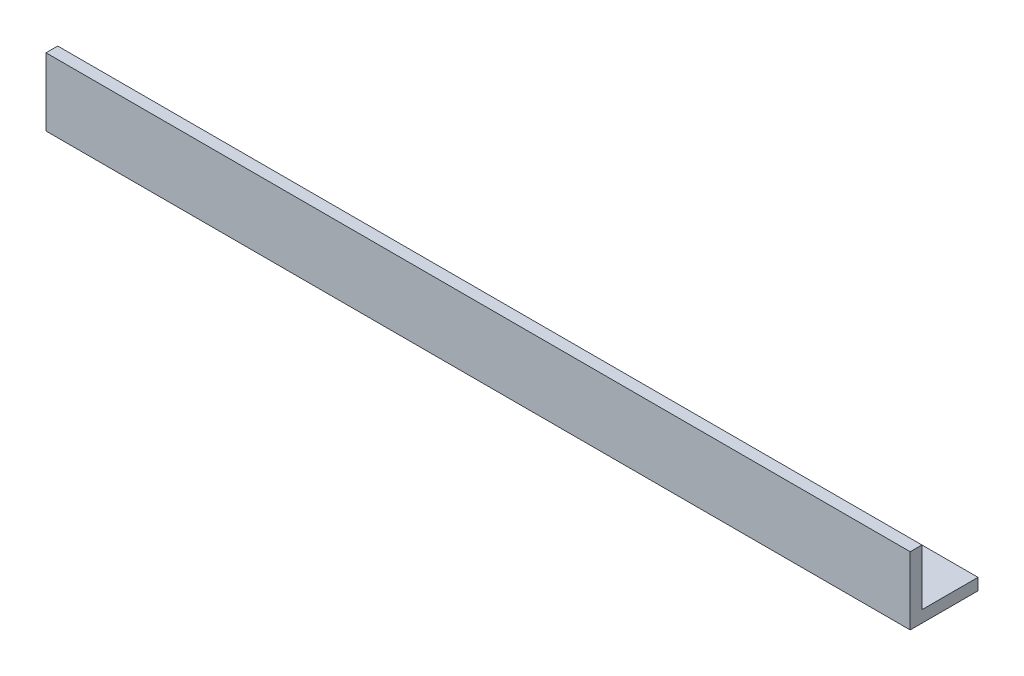
ISO-10303-21;
HEADER;
FILE_DESCRIPTION(('STEP AP214'),'2;1');
FILE_NAME('part.step','',(''),(''),'','','');
FILE_SCHEMA(('AUTOMOTIVE_DESIGN { 1 0 10303 214 1 1 1 1 }'));
ENDSEC;
DATA;
#1=APPLICATION_CONTEXT('core data for automotive mechanical design processes');
#2=APPLICATION_PROTOCOL_DEFINITION('international standard','automotive_design',2000,#1);
#3=PRODUCT_CONTEXT('',#1,'mechanical');
#4=PRODUCT('Part','Part','',(#3));
#5=PRODUCT_RELATED_PRODUCT_CATEGORY('part','',(#4));
#6=PRODUCT_DEFINITION_FORMATION('','',#4);
#7=PRODUCT_DEFINITION_CONTEXT('part definition',#1,'design');
#8=PRODUCT_DEFINITION('design','',#6,#7);
#9=PRODUCT_DEFINITION_SHAPE('','',#8);
#10=(LENGTH_UNIT() NAMED_UNIT(*) SI_UNIT(.MILLI.,.METRE.));
#11=(NAMED_UNIT(*) PLANE_ANGLE_UNIT() SI_UNIT($,.RADIAN.));
#12=(NAMED_UNIT(*) SI_UNIT($,.STERADIAN.) SOLID_ANGLE_UNIT());
#13=UNCERTAINTY_MEASURE_WITH_UNIT(LENGTH_MEASURE(1.E-05),#10,'distance_accuracy_value','');
#14=(GEOMETRIC_REPRESENTATION_CONTEXT(3) GLOBAL_UNCERTAINTY_ASSIGNED_CONTEXT((#13)) GLOBAL_UNIT_ASSIGNED_CONTEXT((#10,
#11,#12)) REPRESENTATION_CONTEXT('',''));
#15=CARTESIAN_POINT('',(0.,0.,0.));
#16=DIRECTION('',(0.,0.,1.));
#17=DIRECTION('',(1.,0.,0.));
#18=AXIS2_PLACEMENT_3D('',#15,#16,#17);
#19=CARTESIAN_POINT('',(255.,20.,0.));
#20=DIRECTION('',(0.,0.,-1.));
#21=DIRECTION('',(0.,1.,0.));
#22=AXIS2_PLACEMENT_3D('',#19,#20,#21);
#23=PLANE('',#22);
#24=DIRECTION('',(0.,-1.,0.));
#25=VECTOR('',#24,1.);
#26=CARTESIAN_POINT('',(0.,20.,0.));
#27=LINE('',#26,#25);
#28=CARTESIAN_POINT('',(0.,20.,0.));
#29=VERTEX_POINT('',#28);
#30=CARTESIAN_POINT('',(0.,0.,0.));
#31=VERTEX_POINT('',#30);
#32=EDGE_CURVE('E121',#29,#31,#27,.T.);
#33=ORIENTED_EDGE('',*,*,#32,.T.);
#34=DIRECTION('',(-1.,0.,0.));
#35=VECTOR('',#34,1.);
#36=CARTESIAN_POINT('',(255.,0.,0.));
#37=LINE('',#36,#35);
#38=CARTESIAN_POINT('',(255.,0.,0.));
#39=VERTEX_POINT('',#38);
#40=EDGE_CURVE('E11',#39,#31,#37,.T.);
#41=ORIENTED_EDGE('',*,*,#40,.F.);
#42=DIRECTION('',(0.,-1.,0.));
#43=VECTOR('',#42,1.);
#44=CARTESIAN_POINT('',(255.,20.,0.));
#45=LINE('',#44,#43);
#46=CARTESIAN_POINT('',(255.,20.,0.));
#47=VERTEX_POINT('',#46);
#48=EDGE_CURVE('E131',#47,#39,#45,.T.);
#49=ORIENTED_EDGE('',*,*,#48,.F.);
#50=DIRECTION('',(-1.,0.,0.));
#51=VECTOR('',#50,1.);
#52=CARTESIAN_POINT('',(255.,20.,0.));
#53=LINE('',#52,#51);
#54=EDGE_CURVE('E117',#47,#29,#53,.T.);
#55=ORIENTED_EDGE('',*,*,#54,.T.);
#56=EDGE_LOOP('',(#33,#41,#49,#55));
#57=FACE_BOUND('',#56,.T.);
#58=ADVANCED_FACE('F37',(#57),#23,.F.);
#59=CARTESIAN_POINT('',(255.,0.,0.));
#60=DIRECTION('',(0.,1.,0.));
#61=DIRECTION('',(0.,0.,1.));
#62=AXIS2_PLACEMENT_3D('',#59,#60,#61);
#63=PLANE('',#62);
#64=DIRECTION('',(0.,0.,-1.));
#65=VECTOR('',#64,1.);
#66=CARTESIAN_POINT('',(0.,0.,0.));
#67=LINE('',#66,#65);
#68=CARTESIAN_POINT('',(0.,0.,-20.));
#69=VERTEX_POINT('',#68);
#70=EDGE_CURVE('E124',#31,#69,#67,.T.);
#71=ORIENTED_EDGE('',*,*,#70,.T.);
#72=DIRECTION('',(-1.,0.,0.));
#73=VECTOR('',#72,1.);
#74=CARTESIAN_POINT('',(255.,0.,-20.));
#75=LINE('',#74,#73);
#76=CARTESIAN_POINT('',(255.,0.,-20.));
#77=VERTEX_POINT('',#76);
#78=EDGE_CURVE('E45',#77,#69,#75,.T.);
#79=ORIENTED_EDGE('',*,*,#78,.F.);
#80=DIRECTION('',(0.,0.,-1.));
#81=VECTOR('',#80,1.);
#82=CARTESIAN_POINT('',(255.,0.,0.));
#83=LINE('',#82,#81);
#84=EDGE_CURVE('E90',#39,#77,#83,.T.);
#85=ORIENTED_EDGE('',*,*,#84,.F.);
#86=ORIENTED_EDGE('',*,*,#40,.T.);
#87=EDGE_LOOP('',(#71,#79,#85,#86));
#88=FACE_BOUND('',#87,.T.);
#89=ADVANCED_FACE('F155',(#88),#63,.F.);
#90=CARTESIAN_POINT('',(255.,0.,-20.));
#91=DIRECTION('',(0.,0.,1.));
#92=DIRECTION('',(1.,0.,0.));
#93=AXIS2_PLACEMENT_3D('',#90,#91,#92);
#94=PLANE('',#93);
#95=DIRECTION('',(0.,1.,0.));
#96=VECTOR('',#95,1.);
#97=CARTESIAN_POINT('',(0.,0.,-20.));
#98=LINE('',#97,#96);
#99=CARTESIAN_POINT('',(0.,3.46117846701572,-20.));
#100=VERTEX_POINT('',#99);
#101=EDGE_CURVE('E126',#69,#100,#98,.T.);
#102=ORIENTED_EDGE('',*,*,#101,.T.);
#103=DIRECTION('',(-1.,0.,0.));
#104=VECTOR('',#103,1.);
#105=CARTESIAN_POINT('',(255.,3.46117846701572,-20.));
#106=LINE('',#105,#104);
#107=CARTESIAN_POINT('',(255.,3.46117846701572,-20.));
#108=VERTEX_POINT('',#107);
#109=EDGE_CURVE('E112',#108,#100,#106,.T.);
#110=ORIENTED_EDGE('',*,*,#109,.F.);
#111=DIRECTION('',(0.,1.,0.));
#112=VECTOR('',#111,1.);
#113=CARTESIAN_POINT('',(255.,0.,-20.));
#114=LINE('',#113,#112);
#115=EDGE_CURVE('E103',#77,#108,#114,.T.);
#116=ORIENTED_EDGE('',*,*,#115,.F.);
#117=ORIENTED_EDGE('',*,*,#78,.T.);
#118=EDGE_LOOP('',(#102,#110,#116,#117));
#119=FACE_BOUND('',#118,.T.);
#120=ADVANCED_FACE('F137',(#119),#94,.F.);
#121=CARTESIAN_POINT('',(255.,3.46117846701572,-20.));
#122=DIRECTION('',(0.,-1.,0.));
#123=DIRECTION('',(0.,0.,-1.));
#124=AXIS2_PLACEMENT_3D('',#121,#122,#123);
#125=PLANE('',#124);
#126=DIRECTION('',(0.,0.,1.));
#127=VECTOR('',#126,1.);
#128=CARTESIAN_POINT('',(0.,3.46117846701572,-20.));
#129=LINE('',#128,#127);
#130=CARTESIAN_POINT('',(0.,3.46117846701572,-3.46117846701572));
#131=VERTEX_POINT('',#130);
#132=EDGE_CURVE('E111',#100,#131,#129,.T.);
#133=ORIENTED_EDGE('',*,*,#132,.T.);
#134=DIRECTION('',(-1.,0.,0.));
#135=VECTOR('',#134,1.);
#136=CARTESIAN_POINT('',(255.,3.46117846701572,-3.46117846701572));
#137=LINE('',#136,#135);
#138=CARTESIAN_POINT('',(255.,3.46117846701572,-3.46117846701572));
#139=VERTEX_POINT('',#138);
#140=EDGE_CURVE('E108',#139,#131,#137,.T.);
#141=ORIENTED_EDGE('',*,*,#140,.F.);
#142=DIRECTION('',(0.,0.,1.));
#143=VECTOR('',#142,1.);
#144=CARTESIAN_POINT('',(255.,3.46117846701572,-20.));
#145=LINE('',#144,#143);
#146=EDGE_CURVE('E97',#108,#139,#145,.T.);
#147=ORIENTED_EDGE('',*,*,#146,.F.);
#148=ORIENTED_EDGE('',*,*,#109,.T.);
#149=EDGE_LOOP('',(#133,#141,#147,#148));
#150=FACE_BOUND('',#149,.T.);
#151=ADVANCED_FACE('F109',(#150),#125,.F.);
#152=CARTESIAN_POINT('',(255.,3.46117846701572,-3.46117846701572));
#153=DIRECTION('',(0.,0.,1.));
#154=DIRECTION('',(1.,0.,0.));
#155=AXIS2_PLACEMENT_3D('',#152,#153,#154);
#156=PLANE('',#155);
#157=DIRECTION('',(0.,1.,0.));
#158=VECTOR('',#157,1.);
#159=CARTESIAN_POINT('',(0.,3.46117846701572,-3.46117846701572));
#160=LINE('',#159,#158);
#161=CARTESIAN_POINT('',(0.,20.,-3.46117846701572));
#162=VERTEX_POINT('',#161);
#163=EDGE_CURVE('E76',#131,#162,#160,.T.);
#164=ORIENTED_EDGE('',*,*,#163,.T.);
#165=DIRECTION('',(-1.,0.,0.));
#166=VECTOR('',#165,1.);
#167=CARTESIAN_POINT('',(255.,20.,-3.46117846701572));
#168=LINE('',#167,#166);
#169=CARTESIAN_POINT('',(255.,20.,-3.46117846701572));
#170=VERTEX_POINT('',#169);
#171=EDGE_CURVE('E113',#170,#162,#168,.T.);
#172=ORIENTED_EDGE('',*,*,#171,.F.);
#173=DIRECTION('',(0.,1.,0.));
#174=VECTOR('',#173,1.);
#175=CARTESIAN_POINT('',(255.,3.46117846701572,-3.46117846701572));
#176=LINE('',#175,#174);
#177=EDGE_CURVE('E101',#139,#170,#176,.T.);
#178=ORIENTED_EDGE('',*,*,#177,.F.);
#179=ORIENTED_EDGE('',*,*,#140,.T.);
#180=EDGE_LOOP('',(#164,#172,#178,#179));
#181=FACE_BOUND('',#180,.T.);
#182=ADVANCED_FACE('F115',(#181),#156,.F.);
#183=CARTESIAN_POINT('',(255.,20.,-3.46117846701572));
#184=DIRECTION('',(0.,-1.,0.));
#185=DIRECTION('',(0.,0.,-1.));
#186=AXIS2_PLACEMENT_3D('',#183,#184,#185);
#187=PLANE('',#186);
#188=DIRECTION('',(0.,0.,1.));
#189=VECTOR('',#188,1.);
#190=CARTESIAN_POINT('',(0.,20.,-3.46117846701572));
#191=LINE('',#190,#189);
#192=EDGE_CURVE('E82',#162,#29,#191,.T.);
#193=ORIENTED_EDGE('',*,*,#192,.T.);
#194=ORIENTED_EDGE('',*,*,#54,.F.);
#195=DIRECTION('',(0.,0.,1.));
#196=VECTOR('',#195,1.);
#197=CARTESIAN_POINT('',(255.,20.,-3.46117846701572));
#198=LINE('',#197,#196);
#199=EDGE_CURVE('E53',#170,#47,#198,.T.);
#200=ORIENTED_EDGE('',*,*,#199,.F.);
#201=ORIENTED_EDGE('',*,*,#171,.T.);
#202=EDGE_LOOP('',(#193,#194,#200,#201));
#203=FACE_BOUND('',#202,.T.);
#204=ADVANCED_FACE('F144',(#203),#187,.F.);
#205=CARTESIAN_POINT('',(255.,0.,0.));
#206=DIRECTION('',(1.,0.,0.));
#207=DIRECTION('',(0.,0.,-1.));
#208=AXIS2_PLACEMENT_3D('',#205,#206,#207);
#209=PLANE('',#208);
#210=ORIENTED_EDGE('',*,*,#48,.T.);
#211=ORIENTED_EDGE('',*,*,#84,.T.);
#212=ORIENTED_EDGE('',*,*,#115,.T.);
#213=ORIENTED_EDGE('',*,*,#146,.T.);
#214=ORIENTED_EDGE('',*,*,#177,.T.);
#215=ORIENTED_EDGE('',*,*,#199,.T.);
#216=EDGE_LOOP('',(#210,#211,#212,#213,#214,#215));
#217=FACE_BOUND('',#216,.T.);
#218=ADVANCED_FACE('F99',(#217),#209,.T.);
#219=CARTESIAN_POINT('',(0.,0.,0.));
#220=DIRECTION('',(1.,0.,0.));
#221=DIRECTION('',(0.,0.,-1.));
#222=AXIS2_PLACEMENT_3D('',#219,#220,#221);
#223=PLANE('',#222);
#224=ORIENTED_EDGE('',*,*,#32,.F.);
#225=ORIENTED_EDGE('',*,*,#192,.F.);
#226=ORIENTED_EDGE('',*,*,#163,.F.);
#227=ORIENTED_EDGE('',*,*,#132,.F.);
#228=ORIENTED_EDGE('',*,*,#101,.F.);
#229=ORIENTED_EDGE('',*,*,#70,.F.);
#230=EDGE_LOOP('',(#224,#225,#226,#227,#228,#229));
#231=FACE_BOUND('',#230,.T.);
#232=ADVANCED_FACE('F140',(#231),#223,.F.);
#233=CLOSED_SHELL('',(#58,#89,#120,#151,#182,#204,#218,#232));
#234=MANIFOLD_SOLID_BREP('B2',#233);
#235=ADVANCED_BREP_SHAPE_REPRESENTATION('',(#18,#234),#14);
#236=SHAPE_DEFINITION_REPRESENTATION(#9,#235);
ENDSEC;
END-ISO-10303-21;
